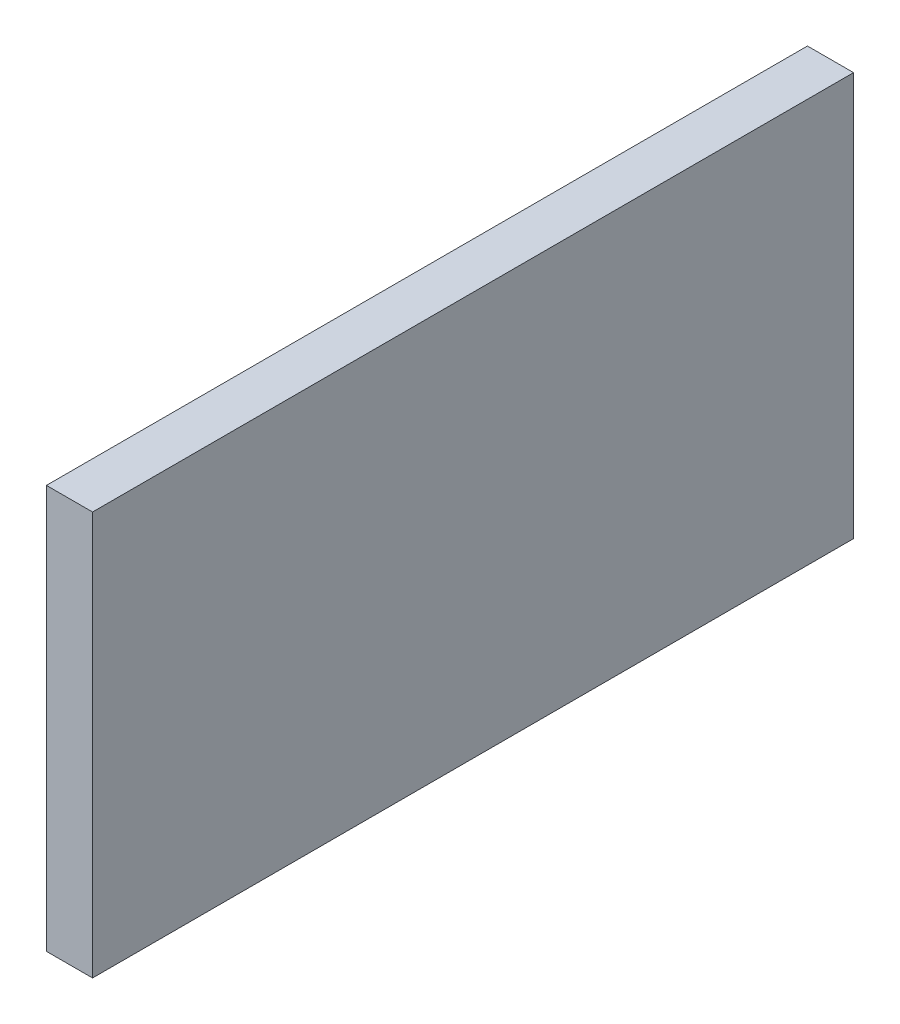
ISO-10303-21;
HEADER;
FILE_DESCRIPTION(('STEP AP214'),'2;1');
FILE_NAME('part.step','',(''),(''),'','','');
FILE_SCHEMA(('AUTOMOTIVE_DESIGN { 1 0 10303 214 1 1 1 1 }'));
ENDSEC;
DATA;
#1=APPLICATION_CONTEXT('core data for automotive mechanical design processes');
#2=APPLICATION_PROTOCOL_DEFINITION('international standard','automotive_design',2000,#1);
#3=PRODUCT_CONTEXT('',#1,'mechanical');
#4=PRODUCT('Part','Part','',(#3));
#5=PRODUCT_RELATED_PRODUCT_CATEGORY('part','',(#4));
#6=PRODUCT_DEFINITION_FORMATION('','',#4);
#7=PRODUCT_DEFINITION_CONTEXT('part definition',#1,'design');
#8=PRODUCT_DEFINITION('design','',#6,#7);
#9=PRODUCT_DEFINITION_SHAPE('','',#8);
#10=(LENGTH_UNIT() NAMED_UNIT(*) SI_UNIT(.MILLI.,.METRE.));
#11=(NAMED_UNIT(*) PLANE_ANGLE_UNIT() SI_UNIT($,.RADIAN.));
#12=(NAMED_UNIT(*) SI_UNIT($,.STERADIAN.) SOLID_ANGLE_UNIT());
#13=UNCERTAINTY_MEASURE_WITH_UNIT(LENGTH_MEASURE(1.E-05),#10,'distance_accuracy_value','');
#14=(GEOMETRIC_REPRESENTATION_CONTEXT(3) GLOBAL_UNCERTAINTY_ASSIGNED_CONTEXT((#13)) GLOBAL_UNIT_ASSIGNED_CONTEXT((#10,
#11,#12)) REPRESENTATION_CONTEXT('',''));
#15=CARTESIAN_POINT('',(0.,0.,0.));
#16=DIRECTION('',(0.,0.,1.));
#17=DIRECTION('',(1.,0.,0.));
#18=AXIS2_PLACEMENT_3D('',#15,#16,#17);
#19=CARTESIAN_POINT('',(0.,0.,66.));
#20=DIRECTION('',(1.,0.,0.));
#21=DIRECTION('',(0.,0.,-1.));
#22=AXIS2_PLACEMENT_3D('',#19,#20,#21);
#23=PLANE('',#22);
#24=DIRECTION('',(0.,-1.,0.));
#25=VECTOR('',#24,1.);
#26=CARTESIAN_POINT('',(0.,0.,0.));
#27=LINE('',#26,#25);
#28=CARTESIAN_POINT('',(0.,35.,0.));
#29=VERTEX_POINT('',#28);
#30=CARTESIAN_POINT('',(0.,0.,0.));
#31=VERTEX_POINT('',#30);
#32=EDGE_CURVE('E108',#29,#31,#27,.T.);
#33=ORIENTED_EDGE('',*,*,#32,.T.);
#34=DIRECTION('',(0.,0.,-1.));
#35=VECTOR('',#34,1.);
#36=CARTESIAN_POINT('',(0.,0.,66.));
#37=LINE('',#36,#35);
#38=CARTESIAN_POINT('',(0.,0.,66.));
#39=VERTEX_POINT('',#38);
#40=EDGE_CURVE('E11',#39,#31,#37,.T.);
#41=ORIENTED_EDGE('',*,*,#40,.F.);
#42=DIRECTION('',(0.,-1.,0.));
#43=VECTOR('',#42,1.);
#44=CARTESIAN_POINT('',(0.,0.,66.));
#45=LINE('',#44,#43);
#46=CARTESIAN_POINT('',(0.,35.,66.));
#47=VERTEX_POINT('',#46);
#48=EDGE_CURVE('E92',#47,#39,#45,.T.);
#49=ORIENTED_EDGE('',*,*,#48,.F.);
#50=DIRECTION('',(0.,0.,-1.));
#51=VECTOR('',#50,1.);
#52=CARTESIAN_POINT('',(0.,35.,66.));
#53=LINE('',#52,#51);
#54=EDGE_CURVE('E105',#47,#29,#53,.T.);
#55=ORIENTED_EDGE('',*,*,#54,.T.);
#56=EDGE_LOOP('',(#33,#41,#49,#55));
#57=FACE_BOUND('',#56,.T.);
#58=ADVANCED_FACE('F43',(#57),#23,.F.);
#59=CARTESIAN_POINT('',(0.,0.,66.));
#60=DIRECTION('',(0.,1.,0.));
#61=DIRECTION('',(0.,0.,1.));
#62=AXIS2_PLACEMENT_3D('',#59,#60,#61);
#63=PLANE('',#62);
#64=DIRECTION('',(1.,0.,0.));
#65=VECTOR('',#64,1.);
#66=CARTESIAN_POINT('',(0.,0.,0.));
#67=LINE('',#66,#65);
#68=CARTESIAN_POINT('',(4.,0.,0.));
#69=VERTEX_POINT('',#68);
#70=EDGE_CURVE('E97',#31,#69,#67,.T.);
#71=ORIENTED_EDGE('',*,*,#70,.T.);
#72=DIRECTION('',(0.,0.,-1.));
#73=VECTOR('',#72,1.);
#74=CARTESIAN_POINT('',(4.,0.,66.));
#75=LINE('',#74,#73);
#76=CARTESIAN_POINT('',(4.,0.,66.));
#77=VERTEX_POINT('',#76);
#78=EDGE_CURVE('E51',#77,#69,#75,.T.);
#79=ORIENTED_EDGE('',*,*,#78,.F.);
#80=DIRECTION('',(1.,0.,0.));
#81=VECTOR('',#80,1.);
#82=CARTESIAN_POINT('',(0.,0.,66.));
#83=LINE('',#82,#81);
#84=EDGE_CURVE('E87',#39,#77,#83,.T.);
#85=ORIENTED_EDGE('',*,*,#84,.F.);
#86=ORIENTED_EDGE('',*,*,#40,.T.);
#87=EDGE_LOOP('',(#71,#79,#85,#86));
#88=FACE_BOUND('',#87,.T.);
#89=ADVANCED_FACE('F100',(#88),#63,.F.);
#90=CARTESIAN_POINT('',(4.,0.,66.));
#91=DIRECTION('',(-1.,0.,0.));
#92=DIRECTION('',(0.,0.,1.));
#93=AXIS2_PLACEMENT_3D('',#90,#91,#92);
#94=PLANE('',#93);
#95=DIRECTION('',(0.,1.,0.));
#96=VECTOR('',#95,1.);
#97=CARTESIAN_POINT('',(4.,0.,0.));
#98=LINE('',#97,#96);
#99=CARTESIAN_POINT('',(4.,35.,0.));
#100=VERTEX_POINT('',#99);
#101=EDGE_CURVE('E78',#69,#100,#98,.T.);
#102=ORIENTED_EDGE('',*,*,#101,.T.);
#103=DIRECTION('',(0.,0.,-1.));
#104=VECTOR('',#103,1.);
#105=CARTESIAN_POINT('',(4.,35.,66.));
#106=LINE('',#105,#104);
#107=CARTESIAN_POINT('',(4.,35.,66.));
#108=VERTEX_POINT('',#107);
#109=EDGE_CURVE('E98',#108,#100,#106,.T.);
#110=ORIENTED_EDGE('',*,*,#109,.F.);
#111=DIRECTION('',(0.,1.,0.));
#112=VECTOR('',#111,1.);
#113=CARTESIAN_POINT('',(4.,0.,66.));
#114=LINE('',#113,#112);
#115=EDGE_CURVE('E95',#77,#108,#114,.T.);
#116=ORIENTED_EDGE('',*,*,#115,.F.);
#117=ORIENTED_EDGE('',*,*,#78,.T.);
#118=EDGE_LOOP('',(#102,#110,#116,#117));
#119=FACE_BOUND('',#118,.T.);
#120=ADVANCED_FACE('F99',(#119),#94,.F.);
#121=CARTESIAN_POINT('',(0.,35.,66.));
#122=DIRECTION('',(0.,-1.,0.));
#123=DIRECTION('',(0.,0.,-1.));
#124=AXIS2_PLACEMENT_3D('',#121,#122,#123);
#125=PLANE('',#124);
#126=DIRECTION('',(-1.,0.,0.));
#127=VECTOR('',#126,1.);
#128=CARTESIAN_POINT('',(0.,35.,0.));
#129=LINE('',#128,#127);
#130=EDGE_CURVE('E85',#100,#29,#129,.T.);
#131=ORIENTED_EDGE('',*,*,#130,.T.);
#132=ORIENTED_EDGE('',*,*,#54,.F.);
#133=DIRECTION('',(-1.,0.,0.));
#134=VECTOR('',#133,1.);
#135=CARTESIAN_POINT('',(0.,35.,66.));
#136=LINE('',#135,#134);
#137=EDGE_CURVE('E56',#108,#47,#136,.T.);
#138=ORIENTED_EDGE('',*,*,#137,.F.);
#139=ORIENTED_EDGE('',*,*,#109,.T.);
#140=EDGE_LOOP('',(#131,#132,#138,#139));
#141=FACE_BOUND('',#140,.T.);
#142=ADVANCED_FACE('F111',(#141),#125,.F.);
#143=CARTESIAN_POINT('',(0.,0.,66.));
#144=DIRECTION('',(0.,0.,-1.));
#145=DIRECTION('',(-1.,0.,0.));
#146=AXIS2_PLACEMENT_3D('',#143,#144,#145);
#147=PLANE('',#146);
#148=ORIENTED_EDGE('',*,*,#48,.T.);
#149=ORIENTED_EDGE('',*,*,#84,.T.);
#150=ORIENTED_EDGE('',*,*,#115,.T.);
#151=ORIENTED_EDGE('',*,*,#137,.T.);
#152=EDGE_LOOP('',(#148,#149,#150,#151));
#153=FACE_BOUND('',#152,.T.);
#154=ADVANCED_FACE('F89',(#153),#147,.F.);
#155=CARTESIAN_POINT('',(0.,0.,0.));
#156=DIRECTION('',(0.,0.,-1.));
#157=DIRECTION('',(-1.,0.,0.));
#158=AXIS2_PLACEMENT_3D('',#155,#156,#157);
#159=PLANE('',#158);
#160=ORIENTED_EDGE('',*,*,#32,.F.);
#161=ORIENTED_EDGE('',*,*,#130,.F.);
#162=ORIENTED_EDGE('',*,*,#101,.F.);
#163=ORIENTED_EDGE('',*,*,#70,.F.);
#164=EDGE_LOOP('',(#160,#161,#162,#163));
#165=FACE_BOUND('',#164,.T.);
#166=ADVANCED_FACE('F118',(#165),#159,.T.);
#167=CLOSED_SHELL('',(#58,#89,#120,#142,#154,#166));
#168=MANIFOLD_SOLID_BREP('B2',#167);
#169=ADVANCED_BREP_SHAPE_REPRESENTATION('',(#18,#168),#14);
#170=SHAPE_DEFINITION_REPRESENTATION(#9,#169);
ENDSEC;
END-ISO-10303-21;
